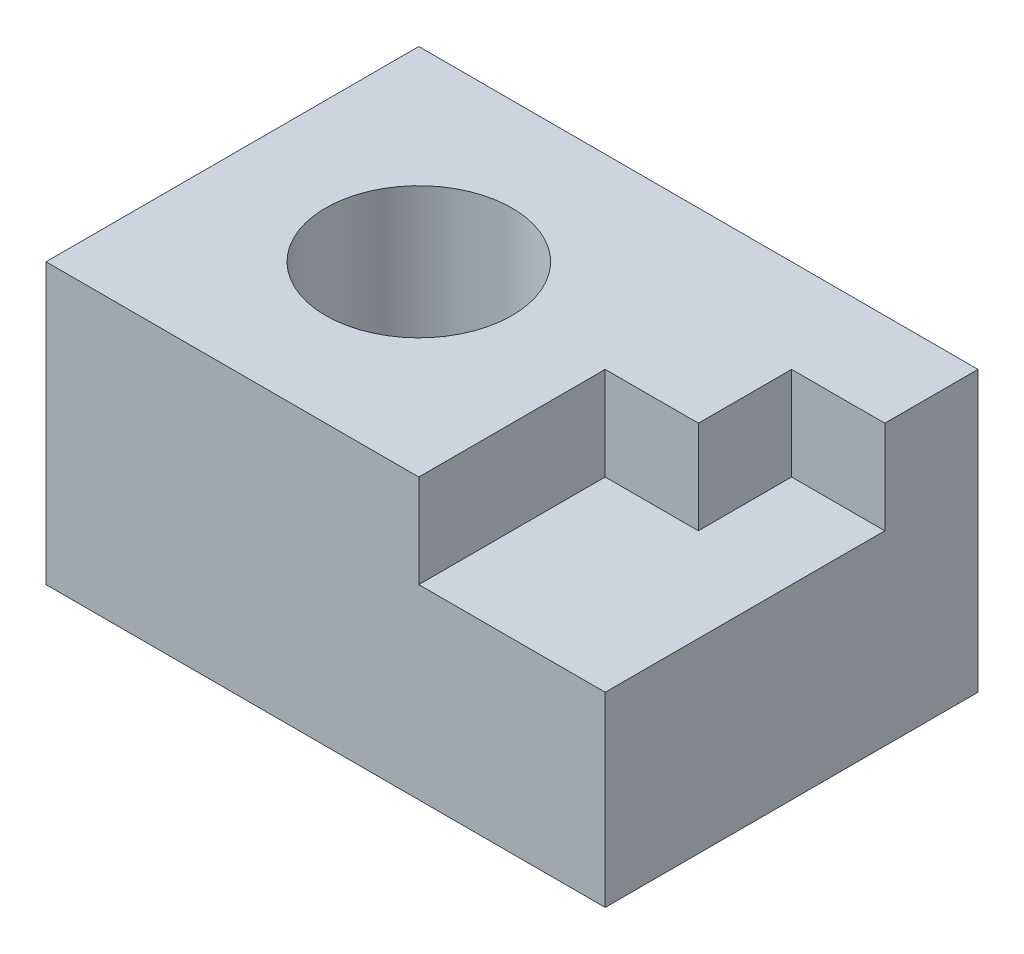
ISO-10303-21;
HEADER;
FILE_DESCRIPTION(('STEP AP214'),'2;1');
FILE_NAME('part.step','',(''),(''),'','','');
FILE_SCHEMA(('AUTOMOTIVE_DESIGN { 1 0 10303 214 1 1 1 1 }'));
ENDSEC;
DATA;
#1=APPLICATION_CONTEXT('core data for automotive mechanical design processes');
#2=APPLICATION_PROTOCOL_DEFINITION('international standard','automotive_design',2000,#1);
#3=PRODUCT_CONTEXT('',#1,'mechanical');
#4=PRODUCT('Part','Part','',(#3));
#5=PRODUCT_RELATED_PRODUCT_CATEGORY('part','',(#4));
#6=PRODUCT_DEFINITION_FORMATION('','',#4);
#7=PRODUCT_DEFINITION_CONTEXT('part definition',#1,'design');
#8=PRODUCT_DEFINITION('design','',#6,#7);
#9=PRODUCT_DEFINITION_SHAPE('','',#8);
#10=(LENGTH_UNIT() NAMED_UNIT(*) SI_UNIT(.MILLI.,.METRE.));
#11=(NAMED_UNIT(*) PLANE_ANGLE_UNIT() SI_UNIT($,.RADIAN.));
#12=(NAMED_UNIT(*) SI_UNIT($,.STERADIAN.) SOLID_ANGLE_UNIT());
#13=UNCERTAINTY_MEASURE_WITH_UNIT(LENGTH_MEASURE(1.E-05),#10,'distance_accuracy_value','');
#14=(GEOMETRIC_REPRESENTATION_CONTEXT(3) GLOBAL_UNCERTAINTY_ASSIGNED_CONTEXT((#13)) GLOBAL_UNIT_ASSIGNED_CONTEXT((#10,
#11,#12)) REPRESENTATION_CONTEXT('',''));
#15=CARTESIAN_POINT('',(0.,0.,0.));
#16=DIRECTION('',(0.,0.,1.));
#17=DIRECTION('',(1.,0.,0.));
#18=AXIS2_PLACEMENT_3D('',#15,#16,#17);
#19=CARTESIAN_POINT('',(0.,76.2,0.));
#20=DIRECTION('',(0.,0.,-1.));
#21=DIRECTION('',(-1.,0.,0.));
#22=AXIS2_PLACEMENT_3D('',#19,#20,#21);
#23=PLANE('',#22);
#24=DIRECTION('',(1.,0.,0.));
#25=VECTOR('',#24,1.);
#26=CARTESIAN_POINT('',(101.6,50.8,0.));
#27=LINE('',#26,#25);
#28=CARTESIAN_POINT('',(101.6,50.8,0.));
#29=VERTEX_POINT('',#28);
#30=CARTESIAN_POINT('',(152.4,50.8,0.));
#31=VERTEX_POINT('',#30);
#32=EDGE_CURVE('E124',#29,#31,#27,.T.);
#33=ORIENTED_EDGE('',*,*,#32,.F.);
#34=DIRECTION('',(0.,1.,0.));
#35=VECTOR('',#34,1.);
#36=CARTESIAN_POINT('',(101.6,50.8,0.));
#37=LINE('',#36,#35);
#38=CARTESIAN_POINT('',(101.6,76.2,0.));
#39=VERTEX_POINT('',#38);
#40=EDGE_CURVE('E150',#29,#39,#37,.T.);
#41=ORIENTED_EDGE('',*,*,#40,.T.);
#42=DIRECTION('',(1.,0.,0.));
#43=VECTOR('',#42,1.);
#44=CARTESIAN_POINT('',(0.,76.2,0.));
#45=LINE('',#44,#43);
#46=CARTESIAN_POINT('',(0.,76.2,0.));
#47=VERTEX_POINT('',#46);
#48=EDGE_CURVE('E137',#47,#39,#45,.T.);
#49=ORIENTED_EDGE('',*,*,#48,.F.);
#50=DIRECTION('',(0.,-1.,0.));
#51=VECTOR('',#50,1.);
#52=CARTESIAN_POINT('',(0.,76.2,0.));
#53=LINE('',#52,#51);
#54=CARTESIAN_POINT('',(0.,0.,0.));
#55=VERTEX_POINT('',#54);
#56=EDGE_CURVE('E56',#47,#55,#53,.T.);
#57=ORIENTED_EDGE('',*,*,#56,.T.);
#58=DIRECTION('',(1.,0.,0.));
#59=VECTOR('',#58,1.);
#60=CARTESIAN_POINT('',(0.,0.,0.));
#61=LINE('',#60,#59);
#62=CARTESIAN_POINT('',(152.4,0.,0.));
#63=VERTEX_POINT('',#62);
#64=EDGE_CURVE('E147',#55,#63,#61,.T.);
#65=ORIENTED_EDGE('',*,*,#64,.T.);
#66=DIRECTION('',(0.,-1.,0.));
#67=VECTOR('',#66,1.);
#68=CARTESIAN_POINT('',(152.4,76.2,0.));
#69=LINE('',#68,#67);
#70=EDGE_CURVE('E11',#31,#63,#69,.T.);
#71=ORIENTED_EDGE('',*,*,#70,.F.);
#72=EDGE_LOOP('',(#33,#41,#49,#57,#65,#71));
#73=FACE_BOUND('',#72,.T.);
#74=ADVANCED_FACE('F33',(#73),#23,.F.);
#75=CARTESIAN_POINT('',(152.4,76.2,0.));
#76=DIRECTION('',(-1.,0.,0.));
#77=DIRECTION('',(0.,0.,1.));
#78=AXIS2_PLACEMENT_3D('',#75,#76,#77);
#79=PLANE('',#78);
#80=DIRECTION('',(0.,0.,-1.));
#81=VECTOR('',#80,1.);
#82=CARTESIAN_POINT('',(152.4,76.2,0.));
#83=LINE('',#82,#81);
#84=CARTESIAN_POINT('',(152.4,76.2,-76.2));
#85=VERTEX_POINT('',#84);
#86=CARTESIAN_POINT('',(152.4,76.2,-101.6));
#87=VERTEX_POINT('',#86);
#88=EDGE_CURVE('E79',#85,#87,#83,.T.);
#89=ORIENTED_EDGE('',*,*,#88,.F.);
#90=DIRECTION('',(0.,1.,0.));
#91=VECTOR('',#90,1.);
#92=CARTESIAN_POINT('',(152.4,50.8,-76.2));
#93=LINE('',#92,#91);
#94=CARTESIAN_POINT('',(152.4,50.8,-76.2));
#95=VERTEX_POINT('',#94);
#96=EDGE_CURVE('E47',#95,#85,#93,.T.);
#97=ORIENTED_EDGE('',*,*,#96,.F.);
#98=DIRECTION('',(0.,0.,-1.));
#99=VECTOR('',#98,1.);
#100=CARTESIAN_POINT('',(152.4,50.8,0.));
#101=LINE('',#100,#99);
#102=EDGE_CURVE('E118',#31,#95,#101,.T.);
#103=ORIENTED_EDGE('',*,*,#102,.F.);
#104=ORIENTED_EDGE('',*,*,#70,.T.);
#105=DIRECTION('',(0.,0.,-1.));
#106=VECTOR('',#105,1.);
#107=CARTESIAN_POINT('',(152.4,0.,0.));
#108=LINE('',#107,#106);
#109=CARTESIAN_POINT('',(152.4,0.,-101.6));
#110=VERTEX_POINT('',#109);
#111=EDGE_CURVE('E149',#63,#110,#108,.T.);
#112=ORIENTED_EDGE('',*,*,#111,.T.);
#113=DIRECTION('',(0.,-1.,0.));
#114=VECTOR('',#113,1.);
#115=CARTESIAN_POINT('',(152.4,76.2,-101.6));
#116=LINE('',#115,#114);
#117=EDGE_CURVE('E40',#87,#110,#116,.T.);
#118=ORIENTED_EDGE('',*,*,#117,.F.);
#119=EDGE_LOOP('',(#89,#97,#103,#104,#112,#118));
#120=FACE_BOUND('',#119,.T.);
#121=ADVANCED_FACE('F129',(#120),#79,.F.);
#122=CARTESIAN_POINT('',(0.,76.2,-101.6));
#123=DIRECTION('',(0.,0.,-1.));
#124=DIRECTION('',(-1.,0.,0.));
#125=AXIS2_PLACEMENT_3D('',#122,#123,#124);
#126=PLANE('',#125);
#127=DIRECTION('',(1.,0.,0.));
#128=VECTOR('',#127,1.);
#129=CARTESIAN_POINT('',(0.,0.,-101.6));
#130=LINE('',#129,#128);
#131=CARTESIAN_POINT('',(0.,0.,-101.6));
#132=VERTEX_POINT('',#131);
#133=EDGE_CURVE('E153',#132,#110,#130,.T.);
#134=ORIENTED_EDGE('',*,*,#133,.F.);
#135=DIRECTION('',(0.,-1.,0.));
#136=VECTOR('',#135,1.);
#137=CARTESIAN_POINT('',(0.,76.2,-101.6));
#138=LINE('',#137,#136);
#139=CARTESIAN_POINT('',(0.,76.2,-101.6));
#140=VERTEX_POINT('',#139);
#141=EDGE_CURVE('E159',#140,#132,#138,.T.);
#142=ORIENTED_EDGE('',*,*,#141,.F.);
#143=DIRECTION('',(1.,0.,0.));
#144=VECTOR('',#143,1.);
#145=CARTESIAN_POINT('',(0.,76.2,-101.6));
#146=LINE('',#145,#144);
#147=EDGE_CURVE('E142',#140,#87,#146,.T.);
#148=ORIENTED_EDGE('',*,*,#147,.T.);
#149=ORIENTED_EDGE('',*,*,#117,.T.);
#150=EDGE_LOOP('',(#134,#142,#148,#149));
#151=FACE_BOUND('',#150,.T.);
#152=ADVANCED_FACE('F162',(#151),#126,.T.);
#153=CARTESIAN_POINT('',(0.,76.2,0.));
#154=DIRECTION('',(-1.,0.,0.));
#155=DIRECTION('',(0.,0.,1.));
#156=AXIS2_PLACEMENT_3D('',#153,#154,#155);
#157=PLANE('',#156);
#158=DIRECTION('',(0.,0.,-1.));
#159=VECTOR('',#158,1.);
#160=CARTESIAN_POINT('',(0.,0.,0.));
#161=LINE('',#160,#159);
#162=EDGE_CURVE('E140',#55,#132,#161,.T.);
#163=ORIENTED_EDGE('',*,*,#162,.F.);
#164=ORIENTED_EDGE('',*,*,#56,.F.);
#165=DIRECTION('',(0.,0.,-1.));
#166=VECTOR('',#165,1.);
#167=CARTESIAN_POINT('',(0.,76.2,0.));
#168=LINE('',#167,#166);
#169=EDGE_CURVE('E145',#47,#140,#168,.T.);
#170=ORIENTED_EDGE('',*,*,#169,.T.);
#171=ORIENTED_EDGE('',*,*,#141,.T.);
#172=EDGE_LOOP('',(#163,#164,#170,#171));
#173=FACE_BOUND('',#172,.T.);
#174=ADVANCED_FACE('F166',(#173),#157,.T.);
#175=CARTESIAN_POINT('',(0.,76.2,0.));
#176=DIRECTION('',(0.,1.,0.));
#177=DIRECTION('',(0.,0.,1.));
#178=AXIS2_PLACEMENT_3D('',#175,#176,#177);
#179=PLANE('',#178);
#180=CARTESIAN_POINT('',(50.8,76.2,-50.8));
#181=DIRECTION('',(0.,1.,0.));
#182=DIRECTION('',(0.,0.,1.));
#183=AXIS2_PLACEMENT_3D('',#180,#181,#182);
#184=CIRCLE('',#183,25.4);
#185=CARTESIAN_POINT('',(50.8,76.2,-25.4));
#186=VERTEX_POINT('',#185);
#187=EDGE_CURVE('E199',#186,#186,#184,.T.);
#188=ORIENTED_EDGE('',*,*,#187,.F.);
#189=EDGE_LOOP('',(#188));
#190=FACE_BOUND('',#189,.T.);
#191=DIRECTION('',(0.,0.,1.));
#192=VECTOR('',#191,1.);
#193=CARTESIAN_POINT('',(101.6,76.2,-50.8));
#194=LINE('',#193,#192);
#195=CARTESIAN_POINT('',(101.6,76.2,-50.8));
#196=VERTEX_POINT('',#195);
#197=EDGE_CURVE('E127',#196,#39,#194,.T.);
#198=ORIENTED_EDGE('',*,*,#197,.F.);
#199=DIRECTION('',(-1.,0.,0.));
#200=VECTOR('',#199,1.);
#201=CARTESIAN_POINT('',(127.,76.2,-50.8));
#202=LINE('',#201,#200);
#203=CARTESIAN_POINT('',(127.,76.2,-50.8));
#204=VERTEX_POINT('',#203);
#205=EDGE_CURVE('E184',#204,#196,#202,.T.);
#206=ORIENTED_EDGE('',*,*,#205,.F.);
#207=DIRECTION('',(0.,0.,1.));
#208=VECTOR('',#207,1.);
#209=CARTESIAN_POINT('',(127.,76.2,-76.2));
#210=LINE('',#209,#208);
#211=CARTESIAN_POINT('',(127.,76.2,-76.2));
#212=VERTEX_POINT('',#211);
#213=EDGE_CURVE('E189',#212,#204,#210,.T.);
#214=ORIENTED_EDGE('',*,*,#213,.F.);
#215=DIRECTION('',(-1.,0.,0.));
#216=VECTOR('',#215,1.);
#217=CARTESIAN_POINT('',(152.4,76.2,-76.2));
#218=LINE('',#217,#216);
#219=EDGE_CURVE('E191',#85,#212,#218,.T.);
#220=ORIENTED_EDGE('',*,*,#219,.F.);
#221=ORIENTED_EDGE('',*,*,#88,.T.);
#222=ORIENTED_EDGE('',*,*,#147,.F.);
#223=ORIENTED_EDGE('',*,*,#169,.F.);
#224=ORIENTED_EDGE('',*,*,#48,.T.);
#225=EDGE_LOOP('',(#198,#206,#214,#220,#221,#222,#223,#224));
#226=FACE_BOUND('',#225,.T.);
#227=ADVANCED_FACE('F169',(#190,#226),#179,.T.);
#228=CARTESIAN_POINT('',(0.,0.,0.));
#229=DIRECTION('',(0.,1.,0.));
#230=DIRECTION('',(0.,0.,1.));
#231=AXIS2_PLACEMENT_3D('',#228,#229,#230);
#232=PLANE('',#231);
#233=CARTESIAN_POINT('',(50.8,0.,-50.8));
#234=DIRECTION('',(0.,1.,0.));
#235=DIRECTION('',(0.,0.,1.));
#236=AXIS2_PLACEMENT_3D('',#233,#234,#235);
#237=CIRCLE('',#236,25.4);
#238=CARTESIAN_POINT('',(50.8,0.,-25.4));
#239=VERTEX_POINT('',#238);
#240=EDGE_CURVE('E194',#239,#239,#237,.T.);
#241=ORIENTED_EDGE('',*,*,#240,.T.);
#242=EDGE_LOOP('',(#241));
#243=FACE_BOUND('',#242,.T.);
#244=ORIENTED_EDGE('',*,*,#64,.F.);
#245=ORIENTED_EDGE('',*,*,#162,.T.);
#246=ORIENTED_EDGE('',*,*,#133,.T.);
#247=ORIENTED_EDGE('',*,*,#111,.F.);
#248=EDGE_LOOP('',(#244,#245,#246,#247));
#249=FACE_BOUND('',#248,.T.);
#250=ADVANCED_FACE('F165',(#243,#249),#232,.F.);
#251=CARTESIAN_POINT('',(101.6,50.8,-50.8));
#252=DIRECTION('',(-1.,0.,0.));
#253=DIRECTION('',(0.,0.,1.));
#254=AXIS2_PLACEMENT_3D('',#251,#252,#253);
#255=PLANE('',#254);
#256=ORIENTED_EDGE('',*,*,#197,.T.);
#257=ORIENTED_EDGE('',*,*,#40,.F.);
#258=DIRECTION('',(0.,0.,1.));
#259=VECTOR('',#258,1.);
#260=CARTESIAN_POINT('',(101.6,50.8,-50.8));
#261=LINE('',#260,#259);
#262=CARTESIAN_POINT('',(101.6,50.8,-50.8));
#263=VERTEX_POINT('',#262);
#264=EDGE_CURVE('E133',#263,#29,#261,.T.);
#265=ORIENTED_EDGE('',*,*,#264,.F.);
#266=DIRECTION('',(0.,1.,0.));
#267=VECTOR('',#266,1.);
#268=CARTESIAN_POINT('',(101.6,50.8,-50.8));
#269=LINE('',#268,#267);
#270=EDGE_CURVE('E174',#263,#196,#269,.T.);
#271=ORIENTED_EDGE('',*,*,#270,.T.);
#272=EDGE_LOOP('',(#256,#257,#265,#271));
#273=FACE_BOUND('',#272,.T.);
#274=ADVANCED_FACE('F218',(#273),#255,.F.);
#275=CARTESIAN_POINT('',(127.,50.8,-50.8));
#276=DIRECTION('',(0.,0.,-1.));
#277=DIRECTION('',(-1.,0.,0.));
#278=AXIS2_PLACEMENT_3D('',#275,#276,#277);
#279=PLANE('',#278);
#280=ORIENTED_EDGE('',*,*,#205,.T.);
#281=ORIENTED_EDGE('',*,*,#270,.F.);
#282=DIRECTION('',(-1.,0.,0.));
#283=VECTOR('',#282,1.);
#284=CARTESIAN_POINT('',(127.,50.8,-50.8));
#285=LINE('',#284,#283);
#286=CARTESIAN_POINT('',(127.,50.8,-50.8));
#287=VERTEX_POINT('',#286);
#288=EDGE_CURVE('E186',#287,#263,#285,.T.);
#289=ORIENTED_EDGE('',*,*,#288,.F.);
#290=DIRECTION('',(0.,1.,0.));
#291=VECTOR('',#290,1.);
#292=CARTESIAN_POINT('',(127.,50.8,-50.8));
#293=LINE('',#292,#291);
#294=EDGE_CURVE('E131',#287,#204,#293,.T.);
#295=ORIENTED_EDGE('',*,*,#294,.T.);
#296=EDGE_LOOP('',(#280,#281,#289,#295));
#297=FACE_BOUND('',#296,.T.);
#298=ADVANCED_FACE('F183',(#297),#279,.F.);
#299=CARTESIAN_POINT('',(127.,50.8,-76.2));
#300=DIRECTION('',(-1.,0.,0.));
#301=DIRECTION('',(0.,0.,1.));
#302=AXIS2_PLACEMENT_3D('',#299,#300,#301);
#303=PLANE('',#302);
#304=ORIENTED_EDGE('',*,*,#213,.T.);
#305=ORIENTED_EDGE('',*,*,#294,.F.);
#306=DIRECTION('',(0.,0.,1.));
#307=VECTOR('',#306,1.);
#308=CARTESIAN_POINT('',(127.,50.8,-76.2));
#309=LINE('',#308,#307);
#310=CARTESIAN_POINT('',(127.,50.8,-76.2));
#311=VERTEX_POINT('',#310);
#312=EDGE_CURVE('E117',#311,#287,#309,.T.);
#313=ORIENTED_EDGE('',*,*,#312,.F.);
#314=DIRECTION('',(0.,1.,0.));
#315=VECTOR('',#314,1.);
#316=CARTESIAN_POINT('',(127.,50.8,-76.2));
#317=LINE('',#316,#315);
#318=EDGE_CURVE('E113',#311,#212,#317,.T.);
#319=ORIENTED_EDGE('',*,*,#318,.T.);
#320=EDGE_LOOP('',(#304,#305,#313,#319));
#321=FACE_BOUND('',#320,.T.);
#322=ADVANCED_FACE('F190',(#321),#303,.F.);
#323=CARTESIAN_POINT('',(152.4,50.8,-76.2));
#324=DIRECTION('',(0.,0.,-1.));
#325=DIRECTION('',(-1.,0.,0.));
#326=AXIS2_PLACEMENT_3D('',#323,#324,#325);
#327=PLANE('',#326);
#328=ORIENTED_EDGE('',*,*,#219,.T.);
#329=ORIENTED_EDGE('',*,*,#318,.F.);
#330=DIRECTION('',(-1.,0.,0.));
#331=VECTOR('',#330,1.);
#332=CARTESIAN_POINT('',(152.4,50.8,-76.2));
#333=LINE('',#332,#331);
#334=EDGE_CURVE('E110',#95,#311,#333,.T.);
#335=ORIENTED_EDGE('',*,*,#334,.F.);
#336=ORIENTED_EDGE('',*,*,#96,.T.);
#337=EDGE_LOOP('',(#328,#329,#335,#336));
#338=FACE_BOUND('',#337,.T.);
#339=ADVANCED_FACE('F112',(#338),#327,.F.);
#340=CARTESIAN_POINT('',(0.,50.8,0.));
#341=DIRECTION('',(0.,1.,0.));
#342=DIRECTION('',(0.,0.,1.));
#343=AXIS2_PLACEMENT_3D('',#340,#341,#342);
#344=PLANE('',#343);
#345=ORIENTED_EDGE('',*,*,#102,.T.);
#346=ORIENTED_EDGE('',*,*,#334,.T.);
#347=ORIENTED_EDGE('',*,*,#312,.T.);
#348=ORIENTED_EDGE('',*,*,#288,.T.);
#349=ORIENTED_EDGE('',*,*,#264,.T.);
#350=ORIENTED_EDGE('',*,*,#32,.T.);
#351=EDGE_LOOP('',(#345,#346,#347,#348,#349,#350));
#352=FACE_BOUND('',#351,.T.);
#353=ADVANCED_FACE('F121',(#352),#344,.T.);
#354=CARTESIAN_POINT('',(50.8,0.,-50.8));
#355=DIRECTION('',(0.,1.,0.));
#356=DIRECTION('',(0.,0.,1.));
#357=AXIS2_PLACEMENT_3D('',#354,#355,#356);
#358=CYLINDRICAL_SURFACE('',#357,25.4);
#359=CARTESIAN_POINT('',(50.8,0.,-25.4));
#360=CARTESIAN_POINT('',(50.8,0.79375,-25.4));
#361=CARTESIAN_POINT('',(50.8,1.5875,-25.4));
#362=CARTESIAN_POINT('',(50.8,3.175,-25.4));
#363=CARTESIAN_POINT('',(50.8,3.96875,-25.4));
#364=CARTESIAN_POINT('',(50.8,5.55625,-25.4));
#365=CARTESIAN_POINT('',(50.8,6.35,-25.4));
#366=CARTESIAN_POINT('',(50.8,7.9375,-25.4));
#367=CARTESIAN_POINT('',(50.8,8.73125,-25.4));
#368=CARTESIAN_POINT('',(50.8,10.31875,-25.4));
#369=CARTESIAN_POINT('',(50.8,11.1125,-25.4));
#370=CARTESIAN_POINT('',(50.8,12.7,-25.4));
#371=CARTESIAN_POINT('',(50.8,13.49375,-25.4));
#372=CARTESIAN_POINT('',(50.8,15.08125,-25.4));
#373=CARTESIAN_POINT('',(50.8,15.875,-25.4));
#374=CARTESIAN_POINT('',(50.8,17.4625,-25.4));
#375=CARTESIAN_POINT('',(50.8,18.25625,-25.4));
#376=CARTESIAN_POINT('',(50.8,19.84375,-25.4));
#377=CARTESIAN_POINT('',(50.8,20.6375,-25.4));
#378=CARTESIAN_POINT('',(50.8,22.225,-25.4));
#379=CARTESIAN_POINT('',(50.8,23.01875,-25.4));
#380=CARTESIAN_POINT('',(50.8,24.60625,-25.4));
#381=CARTESIAN_POINT('',(50.8,25.4,-25.4));
#382=CARTESIAN_POINT('',(50.8,26.9875,-25.4));
#383=CARTESIAN_POINT('',(50.8,27.78125,-25.4));
#384=CARTESIAN_POINT('',(50.8,29.36875,-25.4));
#385=CARTESIAN_POINT('',(50.8,30.1625,-25.4));
#386=CARTESIAN_POINT('',(50.8,31.75,-25.4));
#387=CARTESIAN_POINT('',(50.8,32.54375,-25.4));
#388=CARTESIAN_POINT('',(50.8,34.13125,-25.4));
#389=CARTESIAN_POINT('',(50.8,34.925,-25.4));
#390=CARTESIAN_POINT('',(50.8,36.5125,-25.4));
#391=CARTESIAN_POINT('',(50.8,37.30625,-25.4));
#392=CARTESIAN_POINT('',(50.8,38.89375,-25.4));
#393=CARTESIAN_POINT('',(50.8,39.6875,-25.4));
#394=CARTESIAN_POINT('',(50.8,41.275,-25.4));
#395=CARTESIAN_POINT('',(50.8,42.06875,-25.4));
#396=CARTESIAN_POINT('',(50.8,43.65625,-25.4));
#397=CARTESIAN_POINT('',(50.8,44.45,-25.4));
#398=CARTESIAN_POINT('',(50.8,46.0375,-25.4));
#399=CARTESIAN_POINT('',(50.8,46.83125,-25.4));
#400=CARTESIAN_POINT('',(50.8,48.41875,-25.4));
#401=CARTESIAN_POINT('',(50.8,49.2125,-25.4));
#402=CARTESIAN_POINT('',(50.8,50.8,-25.4));
#403=CARTESIAN_POINT('',(50.8,51.59375,-25.4));
#404=CARTESIAN_POINT('',(50.8,53.18125,-25.4));
#405=CARTESIAN_POINT('',(50.8,53.975,-25.4));
#406=CARTESIAN_POINT('',(50.8,55.5625,-25.4));
#407=CARTESIAN_POINT('',(50.8,56.35625,-25.4));
#408=CARTESIAN_POINT('',(50.8,57.94375,-25.4));
#409=CARTESIAN_POINT('',(50.8,58.7375,-25.4));
#410=CARTESIAN_POINT('',(50.8,60.325,-25.4));
#411=CARTESIAN_POINT('',(50.8,61.11875,-25.4));
#412=CARTESIAN_POINT('',(50.8,62.70625,-25.4));
#413=CARTESIAN_POINT('',(50.8,63.5,-25.4));
#414=CARTESIAN_POINT('',(50.8,65.0875,-25.4));
#415=CARTESIAN_POINT('',(50.8,65.88125,-25.4));
#416=CARTESIAN_POINT('',(50.8,67.46875,-25.4));
#417=CARTESIAN_POINT('',(50.8,68.2625,-25.4));
#418=CARTESIAN_POINT('',(50.8,69.85,-25.4));
#419=CARTESIAN_POINT('',(50.8,70.64375,-25.4));
#420=CARTESIAN_POINT('',(50.8,72.23125,-25.4));
#421=CARTESIAN_POINT('',(50.8,73.025,-25.4));
#422=CARTESIAN_POINT('',(50.8,74.6125,-25.4));
#423=CARTESIAN_POINT('',(50.8,75.40625,-25.4));
#424=CARTESIAN_POINT('',(50.8,76.2,-25.4));
#425=B_SPLINE_CURVE_WITH_KNOTS('',3,(#359,#360,#361,#362,#363,#364,#365,#366,#367,#368,#369,
#370,#371,#372,#373,#374,#375,#376,#377,#378,#379,#380,#381,#382,#383,#384,#385,#386,#387,#388,
#389,#390,#391,#392,#393,#394,#395,#396,#397,#398,#399,#400,#401,#402,#403,#404,#405,#406,#407,
#408,#409,#410,#411,#412,#413,#414,#415,#416,#417,#418,#419,#420,#421,#422,#423,#424),
.UNSPECIFIED.,.F.,.F.,(4,2,2,2,2,2,2,2,2,2,2,2,2,2,2,2,2,2,2,2,2,2,2,2,2,2,2,2,2,2,2,2,4),(0.,
2.38125,4.7625,7.14375,9.525,11.90625,14.2875,16.66875,19.05,21.43125,23.8125,26.19375,28.575,
30.95625,33.3375,35.71875,38.1,40.48125,42.8625,45.24375,47.625,50.00625,52.3875,54.76875,57.15,
59.53125,61.9125,64.29375,66.675,69.05625,71.4375,73.81875,76.2),.UNSPECIFIED.);
#426=EDGE_CURVE('BSEAM206',#239,#186,#425,.T.);
#427=ORIENTED_EDGE('',*,*,#240,.F.);
#428=ORIENTED_EDGE('',*,*,#187,.T.);
#429=ORIENTED_EDGE('',*,*,#426,.T.);
#430=ORIENTED_EDGE('',*,*,#426,.F.);
#431=EDGE_LOOP('',(#427,#429,#428,#430));
#432=FACE_BOUND('',#431,.T.);
#433=ADVANCED_FACE('F206',(#432),#358,.F.);
#434=CLOSED_SHELL('',(#74,#121,#152,#174,#227,#250,#274,#298,#322,#339,#353,#433));
#435=MANIFOLD_SOLID_BREP('B2',#434);
#436=ADVANCED_BREP_SHAPE_REPRESENTATION('',(#18,#435),#14);
#437=SHAPE_DEFINITION_REPRESENTATION(#9,#436);
ENDSEC;
END-ISO-10303-21;
